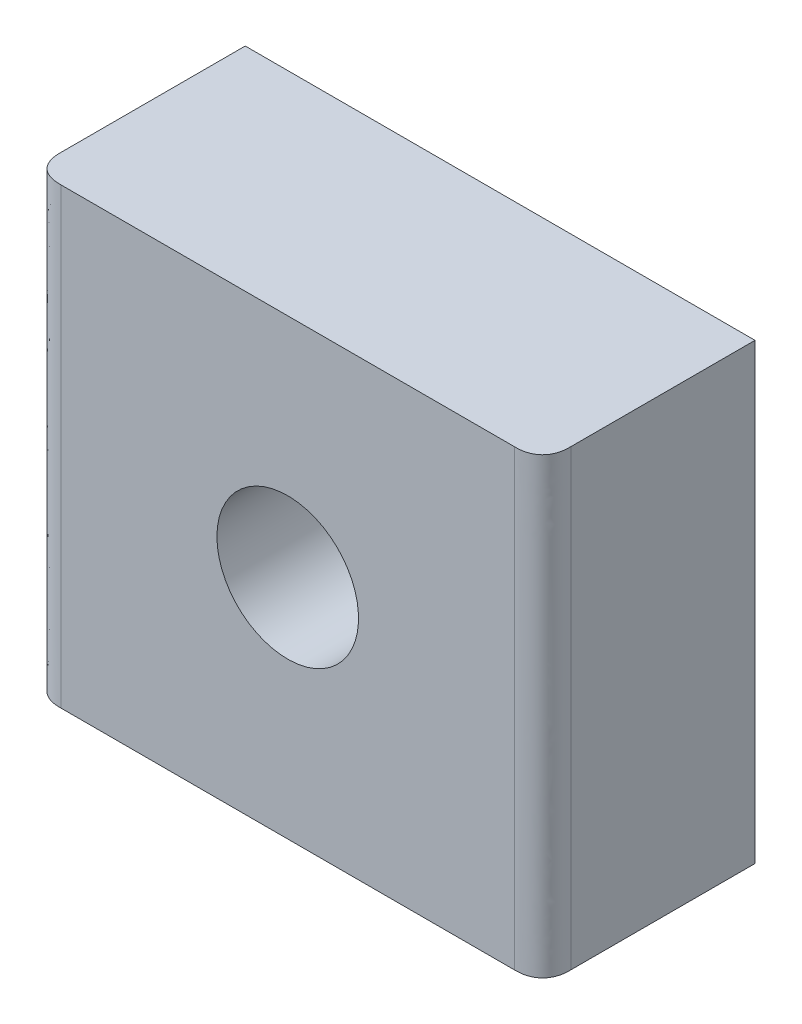
ISO-10303-21;
HEADER;
FILE_DESCRIPTION(('STEP AP214'),'2;1');
FILE_NAME('part.step','',(''),(''),'','','');
FILE_SCHEMA(('AUTOMOTIVE_DESIGN { 1 0 10303 214 1 1 1 1 }'));
ENDSEC;
DATA;
#1=APPLICATION_CONTEXT('core data for automotive mechanical design processes');
#2=APPLICATION_PROTOCOL_DEFINITION('international standard','automotive_design',2000,#1);
#3=PRODUCT_CONTEXT('',#1,'mechanical');
#4=PRODUCT('Part','Part','',(#3));
#5=PRODUCT_RELATED_PRODUCT_CATEGORY('part','',(#4));
#6=PRODUCT_DEFINITION_FORMATION('','',#4);
#7=PRODUCT_DEFINITION_CONTEXT('part definition',#1,'design');
#8=PRODUCT_DEFINITION('design','',#6,#7);
#9=PRODUCT_DEFINITION_SHAPE('','',#8);
#10=(LENGTH_UNIT() NAMED_UNIT(*) SI_UNIT(.MILLI.,.METRE.));
#11=(NAMED_UNIT(*) PLANE_ANGLE_UNIT() SI_UNIT($,.RADIAN.));
#12=(NAMED_UNIT(*) SI_UNIT($,.STERADIAN.) SOLID_ANGLE_UNIT());
#13=UNCERTAINTY_MEASURE_WITH_UNIT(LENGTH_MEASURE(1.E-05),#10,'distance_accuracy_value','');
#14=(GEOMETRIC_REPRESENTATION_CONTEXT(3) GLOBAL_UNCERTAINTY_ASSIGNED_CONTEXT((#13)) GLOBAL_UNIT_ASSIGNED_CONTEXT((#10,
#11,#12)) REPRESENTATION_CONTEXT('',''));
#15=CARTESIAN_POINT('',(0.,0.,0.));
#16=DIRECTION('',(0.,0.,1.));
#17=DIRECTION('',(1.,0.,0.));
#18=AXIS2_PLACEMENT_3D('',#15,#16,#17);
#19=CARTESIAN_POINT('',(0.,0.,0.));
#20=DIRECTION('',(0.,0.,1.));
#21=DIRECTION('',(1.,0.,0.));
#22=AXIS2_PLACEMENT_3D('',#19,#20,#21);
#23=PLANE('',#22);
#24=CARTESIAN_POINT('',(0.,0.,0.));
#25=DIRECTION('',(0.,0.,-1.));
#26=DIRECTION('',(-1.,0.,0.));
#27=AXIS2_PLACEMENT_3D('',#24,#25,#26);
#28=CIRCLE('',#27,2.5);
#29=CARTESIAN_POINT('',(-2.5,0.,0.));
#30=VERTEX_POINT('',#29);
#31=EDGE_CURVE('E182',#30,#30,#28,.T.);
#32=ORIENTED_EDGE('',*,*,#31,.F.);
#33=EDGE_LOOP('',(#32));
#34=FACE_BOUND('',#33,.T.);
#35=DIRECTION('',(1.,0.,0.));
#36=VECTOR('',#35,1.);
#37=CARTESIAN_POINT('',(0.,-8.,0.));
#38=LINE('',#37,#36);
#39=CARTESIAN_POINT('',(-9.,-8.,0.));
#40=VERTEX_POINT('',#39);
#41=CARTESIAN_POINT('',(9.,-8.,0.));
#42=VERTEX_POINT('',#41);
#43=EDGE_CURVE('E275',#40,#42,#38,.T.);
#44=ORIENTED_EDGE('',*,*,#43,.F.);
#45=DIRECTION('',(0.,-1.,0.));
#46=VECTOR('',#45,1.);
#47=CARTESIAN_POINT('',(-9.,0.,0.));
#48=LINE('',#47,#46);
#49=CARTESIAN_POINT('',(-9.,8.,0.));
#50=VERTEX_POINT('',#49);
#51=EDGE_CURVE('E118',#50,#40,#48,.T.);
#52=ORIENTED_EDGE('',*,*,#51,.F.);
#53=DIRECTION('',(1.,0.,0.));
#54=VECTOR('',#53,1.);
#55=CARTESIAN_POINT('',(0.,8.,0.));
#56=LINE('',#55,#54);
#57=CARTESIAN_POINT('',(9.,8.,0.));
#58=VERTEX_POINT('',#57);
#59=EDGE_CURVE('E253',#50,#58,#56,.T.);
#60=ORIENTED_EDGE('',*,*,#59,.T.);
#61=DIRECTION('',(0.,-1.,0.));
#62=VECTOR('',#61,1.);
#63=CARTESIAN_POINT('',(9.,0.,0.));
#64=LINE('',#63,#62);
#65=EDGE_CURVE('E117',#58,#42,#64,.T.);
#66=ORIENTED_EDGE('',*,*,#65,.T.);
#67=EDGE_LOOP('',(#44,#52,#60,#66));
#68=FACE_BOUND('',#67,.T.);
#69=ADVANCED_FACE('F38',(#34,#68),#23,.F.);
#70=CARTESIAN_POINT('',(9.,0.,7.5));
#71=DIRECTION('',(1.,0.,0.));
#72=DIRECTION('',(0.,0.,-1.));
#73=AXIS2_PLACEMENT_3D('',#70,#71,#72);
#74=PLANE('',#73);
#75=CARTESIAN_POINT('',(9.,-9.9,6.5));
#76=CARTESIAN_POINT('',(9.,-9.47777777777778,6.5));
#77=CARTESIAN_POINT('',(9.,-7.06666666666667,6.5));
#78=CARTESIAN_POINT('',(9.,-2.87777777777773,6.5));
#79=CARTESIAN_POINT('',(9.,2.87777777777778,6.5));
#80=CARTESIAN_POINT('',(9.,7.06666666666667,6.5));
#81=CARTESIAN_POINT('',(9.,9.47777777777778,6.5));
#82=CARTESIAN_POINT('',(9.,9.9,6.5));
#83=B_SPLINE_CURVE_WITH_KNOTS('',3,(#75,#76,#77,#78,#79,#80,#81,#82),.UNSPECIFIED.,.F.,.F.,(4,1,
1,1,1,4),(-0.0099,-0.00863333333333333,-0.00266666666666666,0.00266666666666667,
0.00863333333333334,0.0099),.UNSPECIFIED.);
#84=CARTESIAN_POINT('',(9.,8.,6.5));
#85=VERTEX_POINT('',#84);
#86=CARTESIAN_POINT('',(9.,-8.,6.5));
#87=VERTEX_POINT('',#86);
#88=EDGE_CURVE('E11',#85,#87,#83,.F.);
#89=ORIENTED_EDGE('',*,*,#88,.T.);
#90=DIRECTION('',(0.,0.,-1.));
#91=VECTOR('',#90,1.);
#92=CARTESIAN_POINT('',(9.,-8.,7.5));
#93=LINE('',#92,#91);
#94=EDGE_CURVE('E49',#87,#42,#93,.T.);
#95=ORIENTED_EDGE('',*,*,#94,.T.);
#96=ORIENTED_EDGE('',*,*,#65,.F.);
#97=DIRECTION('',(0.,0.,-1.));
#98=VECTOR('',#97,1.);
#99=CARTESIAN_POINT('',(9.,8.,7.5));
#100=LINE('',#99,#98);
#101=EDGE_CURVE('E98',#58,#85,#100,.F.);
#102=ORIENTED_EDGE('',*,*,#101,.T.);
#103=EDGE_LOOP('',(#89,#95,#96,#102));
#104=FACE_BOUND('',#103,.T.);
#105=ADVANCED_FACE('F40',(#104),#74,.T.);
#106=CARTESIAN_POINT('',(-9.,0.,7.5));
#107=DIRECTION('',(1.,0.,0.));
#108=DIRECTION('',(0.,0.,-1.));
#109=AXIS2_PLACEMENT_3D('',#106,#107,#108);
#110=PLANE('',#109);
#111=ORIENTED_EDGE('',*,*,#51,.T.);
#112=DIRECTION('',(0.,0.,-1.));
#113=VECTOR('',#112,1.);
#114=CARTESIAN_POINT('',(-9.,-8.,7.5));
#115=LINE('',#114,#113);
#116=CARTESIAN_POINT('',(-8.99989436399445,-8.00000000038633,6.50092302893012));
#117=VERTEX_POINT('',#116);
#118=EDGE_CURVE('E77',#40,#117,#115,.F.);
#119=ORIENTED_EDGE('',*,*,#118,.T.);
#120=CARTESIAN_POINT('',(-9.,9.9,6.5));
#121=CARTESIAN_POINT('',(-9.,9.47777777777778,6.5));
#122=CARTESIAN_POINT('',(-9.,7.06666666666667,6.5));
#123=CARTESIAN_POINT('',(-9.,2.87777777777778,6.5));
#124=CARTESIAN_POINT('',(-9.,-2.87777777777778,6.5));
#125=CARTESIAN_POINT('',(-9.,-7.06666666666667,6.5));
#126=CARTESIAN_POINT('',(-9.,-9.47777777777778,6.5));
#127=CARTESIAN_POINT('',(-9.,-9.9,6.5));
#128=B_SPLINE_CURVE_WITH_KNOTS('',3,(#120,#121,#122,#123,#124,#125,#126,#127),.UNSPECIFIED.,.F.,
.F.,(4,1,1,1,1,4),(-0.0099,-0.00863333333333333,-0.00266666666666666,0.00266666666666666,
0.00863333333333334,0.0099),.UNSPECIFIED.);
#129=CARTESIAN_POINT('',(-8.99996007999288,8.0000000022783,6.49994285694533));
#130=VERTEX_POINT('',#129);
#131=EDGE_CURVE('E189',#117,#130,#128,.F.);
#132=ORIENTED_EDGE('',*,*,#131,.T.);
#133=DIRECTION('',(0.,0.,-1.));
#134=VECTOR('',#133,1.);
#135=CARTESIAN_POINT('',(-9.,8.,7.5));
#136=LINE('',#135,#134);
#137=EDGE_CURVE('E57',#130,#50,#136,.T.);
#138=ORIENTED_EDGE('',*,*,#137,.T.);
#139=EDGE_LOOP('',(#111,#119,#132,#138));
#140=FACE_BOUND('',#139,.T.);
#141=ADVANCED_FACE('F218',(#140),#110,.F.);
#142=CARTESIAN_POINT('',(0.,0.,7.5));
#143=DIRECTION('',(0.,0.,1.));
#144=DIRECTION('',(1.,0.,0.));
#145=AXIS2_PLACEMENT_3D('',#142,#143,#144);
#146=PLANE('',#145);
#147=CARTESIAN_POINT('',(-8.,-9.9,7.5));
#148=CARTESIAN_POINT('',(-8.,-9.47777777777778,7.5));
#149=CARTESIAN_POINT('',(-8.,-7.06666666666667,7.5));
#150=CARTESIAN_POINT('',(-8.,-2.87777777777778,7.5));
#151=CARTESIAN_POINT('',(-8.,2.87777777777778,7.5));
#152=CARTESIAN_POINT('',(-8.,7.06666666666667,7.5));
#153=CARTESIAN_POINT('',(-8.,9.47777777777778,7.5));
#154=CARTESIAN_POINT('',(-8.,9.9,7.5));
#155=B_SPLINE_CURVE_WITH_KNOTS('',3,(#147,#148,#149,#150,#151,#152,#153,#154),.UNSPECIFIED.,.F.,
.F.,(4,1,1,1,1,4),(-0.0099,-0.00863333333333334,-0.00266666666666666,0.00266666666666666,
0.00863333333333333,0.0099),.UNSPECIFIED.);
#156=CARTESIAN_POINT('',(-8.00000177273408,8.,7.50000943499511));
#157=VERTEX_POINT('',#156);
#158=CARTESIAN_POINT('',(-7.99999998626857,-8.,7.49997162691476));
#159=VERTEX_POINT('',#158);
#160=EDGE_CURVE('E175',#157,#159,#155,.F.);
#161=ORIENTED_EDGE('',*,*,#160,.T.);
#162=DIRECTION('',(1.,0.,0.));
#163=VECTOR('',#162,1.);
#164=CARTESIAN_POINT('',(0.,-8.,7.5));
#165=LINE('',#164,#163);
#166=CARTESIAN_POINT('',(8.,-8.,7.5));
#167=VERTEX_POINT('',#166);
#168=EDGE_CURVE('E174',#159,#167,#165,.T.);
#169=ORIENTED_EDGE('',*,*,#168,.T.);
#170=CARTESIAN_POINT('',(8.,9.9,7.5));
#171=CARTESIAN_POINT('',(8.,9.47777777777778,7.5));
#172=CARTESIAN_POINT('',(8.,7.06666666666667,7.5));
#173=CARTESIAN_POINT('',(8.,2.87777777777778,7.5));
#174=CARTESIAN_POINT('',(8.,-2.87777777777773,7.5));
#175=CARTESIAN_POINT('',(8.,-7.06666666666667,7.5));
#176=CARTESIAN_POINT('',(8.,-9.47777777777778,7.5));
#177=CARTESIAN_POINT('',(8.,-9.9,7.5));
#178=B_SPLINE_CURVE_WITH_KNOTS('',3,(#170,#171,#172,#173,#174,#175,#176,#177),.UNSPECIFIED.,.F.,
.F.,(4,1,1,1,1,4),(-0.0099,-0.00863333333333334,-0.00266666666666667,0.00266666666666666,
0.00863333333333333,0.0099),.UNSPECIFIED.);
#179=CARTESIAN_POINT('',(8.,8.,7.5));
#180=VERTEX_POINT('',#179);
#181=EDGE_CURVE('E170',#167,#180,#178,.F.);
#182=ORIENTED_EDGE('',*,*,#181,.T.);
#183=DIRECTION('',(1.,0.,0.));
#184=VECTOR('',#183,1.);
#185=CARTESIAN_POINT('',(0.,8.,7.5));
#186=LINE('',#185,#184);
#187=EDGE_CURVE('E101',#180,#157,#186,.F.);
#188=ORIENTED_EDGE('',*,*,#187,.T.);
#189=EDGE_LOOP('',(#161,#169,#182,#188));
#190=FACE_BOUND('',#189,.T.);
#191=CARTESIAN_POINT('',(0.,0.,7.5));
#192=DIRECTION('',(0.,0.,-1.));
#193=DIRECTION('',(-1.,0.,0.));
#194=AXIS2_PLACEMENT_3D('',#191,#192,#193);
#195=CIRCLE('',#194,2.5);
#196=CARTESIAN_POINT('',(-2.5,0.,7.5));
#197=VERTEX_POINT('',#196);
#198=EDGE_CURVE('E177',#197,#197,#195,.T.);
#199=ORIENTED_EDGE('',*,*,#198,.T.);
#200=EDGE_LOOP('',(#199));
#201=FACE_BOUND('',#200,.T.);
#202=ADVANCED_FACE('F227',(#190,#201),#146,.T.);
#203=CARTESIAN_POINT('',(0.,0.,7.5));
#204=DIRECTION('',(0.,0.,-1.));
#205=DIRECTION('',(-1.,0.,0.));
#206=AXIS2_PLACEMENT_3D('',#203,#204,#205);
#207=CYLINDRICAL_SURFACE('',#206,2.5);
#208=ORIENTED_EDGE('',*,*,#198,.F.);
#209=EDGE_LOOP('',(#208));
#210=FACE_BOUND('',#209,.T.);
#211=ORIENTED_EDGE('',*,*,#31,.T.);
#212=EDGE_LOOP('',(#211));
#213=FACE_BOUND('',#212,.T.);
#214=ADVANCED_FACE('F143',(#210,#213),#207,.F.);
#215=CARTESIAN_POINT('',(9.,9.9,6.5));
#216=CARTESIAN_POINT('',(9.,9.47777777777778,6.5));
#217=CARTESIAN_POINT('',(9.,7.06666666666667,6.5));
#218=CARTESIAN_POINT('',(9.,2.87777777777778,6.5));
#219=CARTESIAN_POINT('',(9.,-2.87777777777773,6.5));
#220=CARTESIAN_POINT('',(9.,-7.06666666666667,6.5));
#221=CARTESIAN_POINT('',(9.,-9.47777777777778,6.5));
#222=CARTESIAN_POINT('',(9.,-9.9,6.5));
#223=CARTESIAN_POINT('',(9.,9.9,6.65));
#224=CARTESIAN_POINT('',(9.,9.47777777777778,6.65));
#225=CARTESIAN_POINT('',(9.,7.06666666666667,6.65));
#226=CARTESIAN_POINT('',(9.,2.87777777777778,6.65));
#227=CARTESIAN_POINT('',(9.,-2.87777777777773,6.65));
#228=CARTESIAN_POINT('',(9.,-7.06666666666667,6.65));
#229=CARTESIAN_POINT('',(9.,-9.47777777777778,6.65));
#230=CARTESIAN_POINT('',(9.,-9.9,6.65));
#231=CARTESIAN_POINT('',(9.,9.9,6.8));
#232=CARTESIAN_POINT('',(9.,9.47777777777778,6.8));
#233=CARTESIAN_POINT('',(9.,7.06666666666667,6.8));
#234=CARTESIAN_POINT('',(9.,2.87777777777778,6.8));
#235=CARTESIAN_POINT('',(9.,-2.87777777777773,6.8));
#236=CARTESIAN_POINT('',(9.,-7.06666666666667,6.8));
#237=CARTESIAN_POINT('',(9.,-9.47777777777778,6.8));
#238=CARTESIAN_POINT('',(9.,-9.9,6.8));
#239=CARTESIAN_POINT('',(8.9,9.9,7.16666666666667));
#240=CARTESIAN_POINT('',(8.9,9.47777777777778,7.16666666666667));
#241=CARTESIAN_POINT('',(8.9,7.06666666666667,7.16666666666667));
#242=CARTESIAN_POINT('',(8.9,2.87777777777778,7.16666666666666));
#243=CARTESIAN_POINT('',(8.9,-2.87777777777773,7.16666666666667));
#244=CARTESIAN_POINT('',(8.9,-7.06666666666667,7.16666666666667));
#245=CARTESIAN_POINT('',(8.9,-9.47777777777778,7.16666666666667));
#246=CARTESIAN_POINT('',(8.9,-9.9,7.16666666666667));
#247=CARTESIAN_POINT('',(8.66666666666667,9.9,7.4));
#248=CARTESIAN_POINT('',(8.66666666666667,9.47777777777778,7.4));
#249=CARTESIAN_POINT('',(8.66666666666667,7.06666666666667,7.4));
#250=CARTESIAN_POINT('',(8.66666666666667,2.87777777777778,7.4));
#251=CARTESIAN_POINT('',(8.66666666666669,-2.87777777777773,7.4));
#252=CARTESIAN_POINT('',(8.66666666666667,-7.06666666666667,7.4));
#253=CARTESIAN_POINT('',(8.66666666666667,-9.47777777777778,7.4));
#254=CARTESIAN_POINT('',(8.66666666666667,-9.9,7.4));
#255=CARTESIAN_POINT('',(8.3,9.9,7.5));
#256=CARTESIAN_POINT('',(8.3,9.47777777777778,7.5));
#257=CARTESIAN_POINT('',(8.3,7.06666666666667,7.5));
#258=CARTESIAN_POINT('',(8.3,2.87777777777778,7.5));
#259=CARTESIAN_POINT('',(8.3,-2.87777777777773,7.5));
#260=CARTESIAN_POINT('',(8.3,-7.06666666666667,7.5));
#261=CARTESIAN_POINT('',(8.3,-9.47777777777778,7.5));
#262=CARTESIAN_POINT('',(8.3,-9.9,7.5));
#263=CARTESIAN_POINT('',(8.15,9.9,7.5));
#264=CARTESIAN_POINT('',(8.15,9.47777777777778,7.5));
#265=CARTESIAN_POINT('',(8.15,7.06666666666667,7.5));
#266=CARTESIAN_POINT('',(8.15,2.87777777777778,7.5));
#267=CARTESIAN_POINT('',(8.15,-2.87777777777773,7.5));
#268=CARTESIAN_POINT('',(8.15,-7.06666666666667,7.5));
#269=CARTESIAN_POINT('',(8.15,-9.47777777777778,7.5));
#270=CARTESIAN_POINT('',(8.15,-9.9,7.5));
#271=CARTESIAN_POINT('',(8.,9.9,7.5));
#272=CARTESIAN_POINT('',(8.,9.47777777777778,7.5));
#273=CARTESIAN_POINT('',(8.,7.06666666666667,7.5));
#274=CARTESIAN_POINT('',(8.,2.87777777777778,7.5));
#275=CARTESIAN_POINT('',(8.,-2.87777777777773,7.5));
#276=CARTESIAN_POINT('',(8.,-7.06666666666667,7.5));
#277=CARTESIAN_POINT('',(8.,-9.47777777777778,7.5));
#278=CARTESIAN_POINT('',(8.,-9.9,7.5));
#279=B_SPLINE_SURFACE_WITH_KNOTS('',5,3,((#215,#216,#217,#218,#219,#220,#221,#222),(#223,#224,
#225,#226,#227,#228,#229,#230),(#231,#232,#233,#234,#235,#236,#237,#238),(#239,#240,#241,#242,
#243,#244,#245,#246),(#247,#248,#249,#250,#251,#252,#253,#254),(#255,#256,#257,#258,#259,#260,
#261,#262),(#263,#264,#265,#266,#267,#268,#269,#270),(#271,#272,#273,#274,#275,#276,#277,#278)),
.UNSPECIFIED.,.F.,.F.,.F.,(6,2,6),(4,1,1,1,1,4),(0.,0.5,1.),(-0.0099,-0.00863333333333334,
-0.00266666666666667,0.00266666666666666,0.00863333333333333,0.0099),.UNSPECIFIED.);
#280=CARTESIAN_POINT('',(8.,-8.,7.5));
#281=CARTESIAN_POINT('',(8.15,-8.,7.5));
#282=CARTESIAN_POINT('',(8.3,-8.,7.5));
#283=CARTESIAN_POINT('',(8.66666666666667,-8.,7.4));
#284=CARTESIAN_POINT('',(8.9,-8.,7.16666666666667));
#285=CARTESIAN_POINT('',(9.,-8.,6.8));
#286=CARTESIAN_POINT('',(9.,-8.,6.65));
#287=CARTESIAN_POINT('',(9.,-8.,6.5));
#288=B_SPLINE_CURVE_WITH_KNOTS('',5,(#280,#281,#282,#283,#284,#285,#286,#287),.UNSPECIFIED.,.F.,
.F.,(6,2,6),(0.,0.5,1.),.UNSPECIFIED.);
#289=EDGE_CURVE('E107',#87,#167,#288,.F.);
#290=CARTESIAN_POINT('',(9.,8.,6.5));
#291=CARTESIAN_POINT('',(9.,8.,6.65));
#292=CARTESIAN_POINT('',(9.,8.,6.8));
#293=CARTESIAN_POINT('',(8.9,8.,7.16666666666667));
#294=CARTESIAN_POINT('',(8.66666666666667,8.,7.4));
#295=CARTESIAN_POINT('',(8.3,8.,7.5));
#296=CARTESIAN_POINT('',(8.15,8.,7.5));
#297=CARTESIAN_POINT('',(8.,8.,7.5));
#298=B_SPLINE_CURVE_WITH_KNOTS('',5,(#290,#291,#292,#293,#294,#295,#296,#297),.UNSPECIFIED.,.F.,
.F.,(6,2,6),(0.,0.5,1.),.UNSPECIFIED.);
#299=EDGE_CURVE('E94',#180,#85,#298,.F.);
#300=ORIENTED_EDGE('',*,*,#289,.F.);
#301=ORIENTED_EDGE('',*,*,#88,.F.);
#302=ORIENTED_EDGE('',*,*,#299,.F.);
#303=ORIENTED_EDGE('',*,*,#181,.F.);
#304=EDGE_LOOP('',(#300,#301,#302,#303));
#305=FACE_BOUND('',#304,.T.);
#306=ADVANCED_FACE('F121',(#305),#279,.T.);
#307=CARTESIAN_POINT('',(-9.,-9.9,6.5));
#308=CARTESIAN_POINT('',(-9.,-9.47777777777778,6.5));
#309=CARTESIAN_POINT('',(-9.,-7.06666666666667,6.5));
#310=CARTESIAN_POINT('',(-9.,-2.87777777777778,6.5));
#311=CARTESIAN_POINT('',(-9.,2.87777777777778,6.5));
#312=CARTESIAN_POINT('',(-9.,7.06666666666667,6.5));
#313=CARTESIAN_POINT('',(-9.,9.47777777777778,6.5));
#314=CARTESIAN_POINT('',(-9.,9.9,6.5));
#315=CARTESIAN_POINT('',(-9.,-9.9,6.65));
#316=CARTESIAN_POINT('',(-9.,-9.47777777777778,6.65));
#317=CARTESIAN_POINT('',(-9.,-7.06666666666667,6.65));
#318=CARTESIAN_POINT('',(-9.,-2.87777777777778,6.65));
#319=CARTESIAN_POINT('',(-9.,2.87777777777778,6.65));
#320=CARTESIAN_POINT('',(-9.,7.06666666666667,6.65));
#321=CARTESIAN_POINT('',(-9.,9.47777777777778,6.65));
#322=CARTESIAN_POINT('',(-9.,9.9,6.65));
#323=CARTESIAN_POINT('',(-9.,-9.9,6.8));
#324=CARTESIAN_POINT('',(-9.,-9.47777777777778,6.8));
#325=CARTESIAN_POINT('',(-9.,-7.06666666666667,6.8));
#326=CARTESIAN_POINT('',(-9.,-2.87777777777778,6.8));
#327=CARTESIAN_POINT('',(-9.,2.87777777777778,6.8));
#328=CARTESIAN_POINT('',(-9.,7.06666666666667,6.8));
#329=CARTESIAN_POINT('',(-9.,9.47777777777778,6.8));
#330=CARTESIAN_POINT('',(-9.,9.9,6.8));
#331=CARTESIAN_POINT('',(-8.9,-9.9,7.16666666666667));
#332=CARTESIAN_POINT('',(-8.9,-9.47777777777778,7.16666666666667));
#333=CARTESIAN_POINT('',(-8.9,-7.06666666666667,7.16666666666667));
#334=CARTESIAN_POINT('',(-8.9,-2.87777777777778,7.16666666666667));
#335=CARTESIAN_POINT('',(-8.9,2.87777777777778,7.16666666666667));
#336=CARTESIAN_POINT('',(-8.9,7.06666666666667,7.16666666666667));
#337=CARTESIAN_POINT('',(-8.9,9.47777777777778,7.16666666666667));
#338=CARTESIAN_POINT('',(-8.9,9.9,7.16666666666667));
#339=CARTESIAN_POINT('',(-8.66666666666667,-9.9,7.4));
#340=CARTESIAN_POINT('',(-8.66666666666667,-9.47777777777778,7.4));
#341=CARTESIAN_POINT('',(-8.66666666666667,-7.06666666666667,7.4));
#342=CARTESIAN_POINT('',(-8.66666666666668,-2.87777777777778,7.4));
#343=CARTESIAN_POINT('',(-8.66666666666668,2.87777777777778,7.4));
#344=CARTESIAN_POINT('',(-8.66666666666667,7.06666666666667,7.4));
#345=CARTESIAN_POINT('',(-8.66666666666667,9.47777777777778,7.4));
#346=CARTESIAN_POINT('',(-8.66666666666667,9.9,7.4));
#347=CARTESIAN_POINT('',(-8.3,-9.9,7.5));
#348=CARTESIAN_POINT('',(-8.3,-9.47777777777778,7.5));
#349=CARTESIAN_POINT('',(-8.3,-7.06666666666667,7.5));
#350=CARTESIAN_POINT('',(-8.3,-2.87777777777778,7.5));
#351=CARTESIAN_POINT('',(-8.3,2.87777777777778,7.5));
#352=CARTESIAN_POINT('',(-8.3,7.06666666666667,7.5));
#353=CARTESIAN_POINT('',(-8.3,9.47777777777778,7.5));
#354=CARTESIAN_POINT('',(-8.3,9.9,7.5));
#355=CARTESIAN_POINT('',(-8.15,-9.9,7.5));
#356=CARTESIAN_POINT('',(-8.15,-9.47777777777778,7.5));
#357=CARTESIAN_POINT('',(-8.15,-7.06666666666667,7.5));
#358=CARTESIAN_POINT('',(-8.15,-2.87777777777778,7.5));
#359=CARTESIAN_POINT('',(-8.15,2.87777777777778,7.5));
#360=CARTESIAN_POINT('',(-8.15,7.06666666666667,7.5));
#361=CARTESIAN_POINT('',(-8.15,9.47777777777778,7.5));
#362=CARTESIAN_POINT('',(-8.15,9.9,7.5));
#363=CARTESIAN_POINT('',(-8.,-9.9,7.5));
#364=CARTESIAN_POINT('',(-8.,-9.47777777777778,7.5));
#365=CARTESIAN_POINT('',(-8.,-7.06666666666667,7.5));
#366=CARTESIAN_POINT('',(-8.,-2.87777777777778,7.5));
#367=CARTESIAN_POINT('',(-8.,2.87777777777778,7.5));
#368=CARTESIAN_POINT('',(-8.,7.06666666666667,7.5));
#369=CARTESIAN_POINT('',(-8.,9.47777777777778,7.5));
#370=CARTESIAN_POINT('',(-8.,9.9,7.5));
#371=B_SPLINE_SURFACE_WITH_KNOTS('',5,3,((#307,#308,#309,#310,#311,#312,#313,#314),(#315,#316,
#317,#318,#319,#320,#321,#322),(#323,#324,#325,#326,#327,#328,#329,#330),(#331,#332,#333,#334,
#335,#336,#337,#338),(#339,#340,#341,#342,#343,#344,#345,#346),(#347,#348,#349,#350,#351,#352,
#353,#354),(#355,#356,#357,#358,#359,#360,#361,#362),(#363,#364,#365,#366,#367,#368,#369,#370)),
.UNSPECIFIED.,.F.,.F.,.F.,(6,2,6),(4,1,1,1,1,4),(0.,0.5,1.),(-0.0099,-0.00863333333333334,
-0.00266666666666666,0.00266666666666666,0.00863333333333333,0.0099),.UNSPECIFIED.);
#372=CARTESIAN_POINT('',(-8.,8.,7.5));
#373=CARTESIAN_POINT('',(-8.15,8.,7.5));
#374=CARTESIAN_POINT('',(-8.3,8.,7.5));
#375=CARTESIAN_POINT('',(-8.66666666666667,8.,7.4));
#376=CARTESIAN_POINT('',(-8.9,8.,7.16666666666667));
#377=CARTESIAN_POINT('',(-9.,8.,6.8));
#378=CARTESIAN_POINT('',(-9.,8.,6.65));
#379=CARTESIAN_POINT('',(-9.,8.,6.5));
#380=B_SPLINE_CURVE_WITH_KNOTS('',5,(#372,#373,#374,#375,#376,#377,#378,#379),.UNSPECIFIED.,.F.,
.F.,(6,2,6),(0.,0.5,1.),.UNSPECIFIED.);
#381=EDGE_CURVE('E108',#157,#130,#380,.T.);
#382=CARTESIAN_POINT('',(-9.,-8.,6.5));
#383=CARTESIAN_POINT('',(-9.,-8.,6.65));
#384=CARTESIAN_POINT('',(-9.,-8.,6.8));
#385=CARTESIAN_POINT('',(-8.9,-8.,7.16666666666667));
#386=CARTESIAN_POINT('',(-8.66666666666667,-8.,7.4));
#387=CARTESIAN_POINT('',(-8.3,-8.,7.5));
#388=CARTESIAN_POINT('',(-8.15,-8.,7.5));
#389=CARTESIAN_POINT('',(-8.,-8.,7.5));
#390=B_SPLINE_CURVE_WITH_KNOTS('',5,(#382,#383,#384,#385,#386,#387,#388,#389),.UNSPECIFIED.,.F.,
.F.,(6,2,6),(0.,0.5,1.),.UNSPECIFIED.);
#391=EDGE_CURVE('E84',#117,#159,#390,.T.);
#392=ORIENTED_EDGE('',*,*,#381,.T.);
#393=ORIENTED_EDGE('',*,*,#131,.F.);
#394=ORIENTED_EDGE('',*,*,#391,.T.);
#395=ORIENTED_EDGE('',*,*,#160,.F.);
#396=EDGE_LOOP('',(#392,#393,#394,#395));
#397=FACE_BOUND('',#396,.T.);
#398=ADVANCED_FACE('F142',(#397),#371,.T.);
#399=CARTESIAN_POINT('',(0.,8.,0.));
#400=DIRECTION('',(0.,-1.,0.));
#401=DIRECTION('',(0.,0.,-1.));
#402=AXIS2_PLACEMENT_3D('',#399,#400,#401);
#403=PLANE('',#402);
#404=ORIENTED_EDGE('',*,*,#137,.F.);
#405=ORIENTED_EDGE('',*,*,#381,.F.);
#406=ORIENTED_EDGE('',*,*,#187,.F.);
#407=ORIENTED_EDGE('',*,*,#299,.T.);
#408=ORIENTED_EDGE('',*,*,#101,.F.);
#409=ORIENTED_EDGE('',*,*,#59,.F.);
#410=EDGE_LOOP('',(#404,#405,#406,#407,#408,#409));
#411=FACE_BOUND('',#410,.T.);
#412=ADVANCED_FACE('F97',(#411),#403,.F.);
#413=CARTESIAN_POINT('',(0.,-8.,0.));
#414=DIRECTION('',(0.,-1.,0.));
#415=DIRECTION('',(0.,0.,-1.));
#416=AXIS2_PLACEMENT_3D('',#413,#414,#415);
#417=PLANE('',#416);
#418=ORIENTED_EDGE('',*,*,#289,.T.);
#419=ORIENTED_EDGE('',*,*,#168,.F.);
#420=ORIENTED_EDGE('',*,*,#391,.F.);
#421=ORIENTED_EDGE('',*,*,#118,.F.);
#422=ORIENTED_EDGE('',*,*,#43,.T.);
#423=ORIENTED_EDGE('',*,*,#94,.F.);
#424=EDGE_LOOP('',(#418,#419,#420,#421,#422,#423));
#425=FACE_BOUND('',#424,.T.);
#426=ADVANCED_FACE('F245',(#425),#417,.T.);
#427=CLOSED_SHELL('',(#69,#105,#141,#202,#214,#306,#398,#412,#426));
#428=MANIFOLD_SOLID_BREP('B2',#427);
#429=ADVANCED_BREP_SHAPE_REPRESENTATION('',(#18,#428),#14);
#430=SHAPE_DEFINITION_REPRESENTATION(#9,#429);
ENDSEC;
END-ISO-10303-21;
